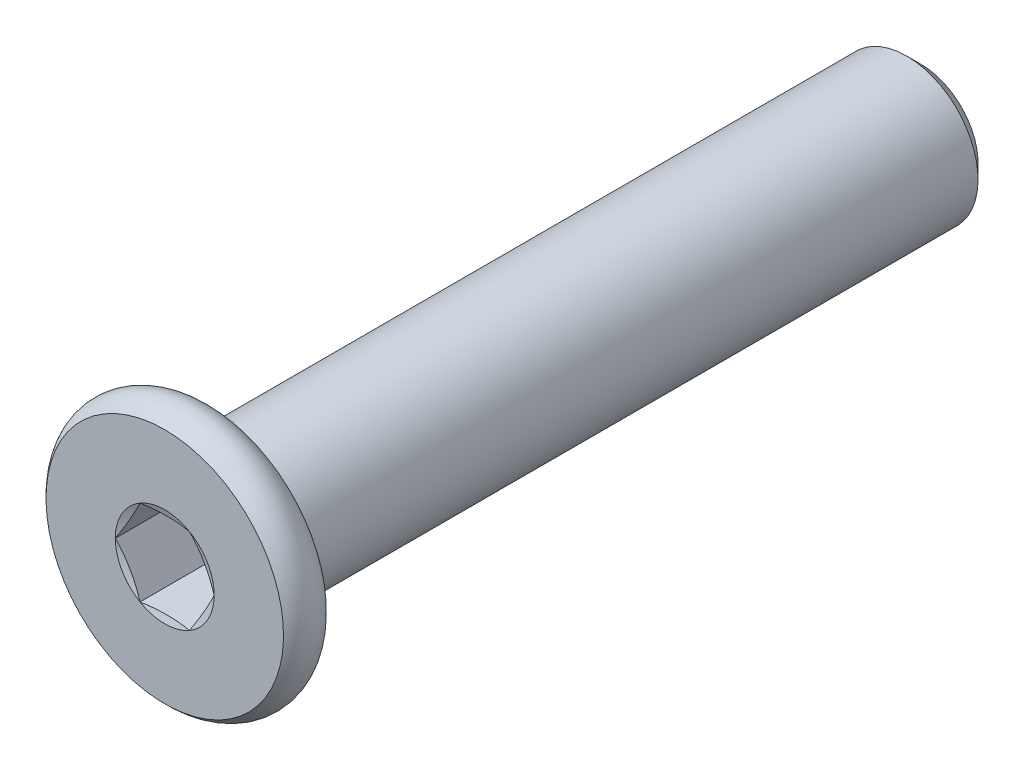
ISO-10303-21;
HEADER;
FILE_DESCRIPTION(('STEP AP214'),'2;1');
FILE_NAME('part.step','',(''),(''),'','','');
FILE_SCHEMA(('AUTOMOTIVE_DESIGN { 1 0 10303 214 1 1 1 1 }'));
ENDSEC;
DATA;
#1=APPLICATION_CONTEXT('core data for automotive mechanical design processes');
#2=APPLICATION_PROTOCOL_DEFINITION('international standard','automotive_design',2000,#1);
#3=PRODUCT_CONTEXT('',#1,'mechanical');
#4=PRODUCT('Part','Part','',(#3));
#5=PRODUCT_RELATED_PRODUCT_CATEGORY('part','',(#4));
#6=PRODUCT_DEFINITION_FORMATION('','',#4);
#7=PRODUCT_DEFINITION_CONTEXT('part definition',#1,'design');
#8=PRODUCT_DEFINITION('design','',#6,#7);
#9=PRODUCT_DEFINITION_SHAPE('','',#8);
#10=(LENGTH_UNIT() NAMED_UNIT(*) SI_UNIT(.MILLI.,.METRE.));
#11=(NAMED_UNIT(*) PLANE_ANGLE_UNIT() SI_UNIT($,.RADIAN.));
#12=(NAMED_UNIT(*) SI_UNIT($,.STERADIAN.) SOLID_ANGLE_UNIT());
#13=UNCERTAINTY_MEASURE_WITH_UNIT(LENGTH_MEASURE(1.E-05),#10,'distance_accuracy_value','');
#14=(GEOMETRIC_REPRESENTATION_CONTEXT(3) GLOBAL_UNCERTAINTY_ASSIGNED_CONTEXT((#13)) GLOBAL_UNIT_ASSIGNED_CONTEXT((#10,
#11,#12)) REPRESENTATION_CONTEXT('',''));
#15=CARTESIAN_POINT('',(0.,0.,0.));
#16=DIRECTION('',(0.,0.,1.));
#17=DIRECTION('',(1.,0.,0.));
#18=AXIS2_PLACEMENT_3D('',#15,#16,#17);
#19=CARTESIAN_POINT('',(0.,0.,19.6597066666667));
#20=DIRECTION('',(0.,0.,1.));
#21=DIRECTION('',(1.,0.,0.));
#22=AXIS2_PLACEMENT_3D('',#19,#20,#21);
#23=SPHERICAL_SURFACE('',#22,5.14970666666667);
#24=CARTESIAN_POINT('',(0.,1.49995599935464,19.6597066666667));
#25=DIRECTION('',(0.,1.,0.));
#26=DIRECTION('',(0.,0.,1.));
#27=AXIS2_PLACEMENT_3D('',#24,#25,#26);
#28=CIRCLE('',#27,4.92641966875652);
#29=CARTESIAN_POINT('',(0.866,1.49995599935464,14.81));
#30=VERTEX_POINT('',#29);
#31=CARTESIAN_POINT('',(-0.866,1.49995599935464,14.81));
#32=VERTEX_POINT('',#31);
#33=EDGE_CURVE('E141',#30,#32,#28,.T.);
#34=ORIENTED_EDGE('',*,*,#33,.F.);
#35=CARTESIAN_POINT('',(0.,0.,14.81));
#36=DIRECTION('',(0.,0.,-1.));
#37=DIRECTION('',(0.,1.,0.));
#38=AXIS2_PLACEMENT_3D('',#35,#36,#37);
#39=CIRCLE('',#38,1.732);
#40=EDGE_CURVE('E167',#32,#30,#39,.T.);
#41=ORIENTED_EDGE('',*,*,#40,.F.);
#42=EDGE_LOOP('',(#34,#41));
#43=FACE_BOUND('',#42,.T.);
#44=ADVANCED_FACE('F16',(#43),#23,.F.);
#45=CARTESIAN_POINT('',(0.,0.,19.6597066666667));
#46=DIRECTION('',(0.,0.,1.));
#47=DIRECTION('',(1.,0.,0.));
#48=AXIS2_PLACEMENT_3D('',#45,#46,#47);
#49=SPHERICAL_SURFACE('',#48,5.14970666666667);
#50=CARTESIAN_POINT('',(0.,0.,14.81));
#51=DIRECTION('',(0.,0.,-1.));
#52=DIRECTION('',(0.,1.,0.));
#53=AXIS2_PLACEMENT_3D('',#50,#51,#52);
#54=CIRCLE('',#53,1.732);
#55=CARTESIAN_POINT('',(1.732,0.,14.81));
#56=VERTEX_POINT('',#55);
#57=CARTESIAN_POINT('',(0.866,-1.49995599935465,14.81));
#58=VERTEX_POINT('',#57);
#59=EDGE_CURVE('E126',#56,#58,#54,.T.);
#60=ORIENTED_EDGE('',*,*,#59,.F.);
#61=CARTESIAN_POINT('',(1.299,-0.749977999677325,19.6597066666667));
#62=DIRECTION('',(0.866025403784439,-0.5,0.));
#63=DIRECTION('',(0.,0.,-1.));
#64=AXIS2_PLACEMENT_3D('',#61,#62,#63);
#65=CIRCLE('',#64,4.92641966875652);
#66=EDGE_CURVE('E110',#58,#56,#65,.T.);
#67=ORIENTED_EDGE('',*,*,#66,.F.);
#68=EDGE_LOOP('',(#60,#67));
#69=FACE_BOUND('',#68,.T.);
#70=ADVANCED_FACE('F223',(#69),#49,.F.);
#71=CARTESIAN_POINT('',(0.,0.,19.6597066666667));
#72=DIRECTION('',(0.,0.,1.));
#73=DIRECTION('',(1.,0.,0.));
#74=AXIS2_PLACEMENT_3D('',#71,#72,#73);
#75=SPHERICAL_SURFACE('',#74,5.14970666666667);
#76=CARTESIAN_POINT('',(0.,0.,14.81));
#77=DIRECTION('',(0.,0.,-1.));
#78=DIRECTION('',(0.,1.,0.));
#79=AXIS2_PLACEMENT_3D('',#76,#77,#78);
#80=CIRCLE('',#79,1.732);
#81=CARTESIAN_POINT('',(-0.866,-1.49995599935465,14.81));
#82=VERTEX_POINT('',#81);
#83=EDGE_CURVE('E130',#58,#82,#80,.T.);
#84=ORIENTED_EDGE('',*,*,#83,.F.);
#85=CARTESIAN_POINT('',(0.,-1.49995599935465,19.6597066666667));
#86=DIRECTION('',(0.,-1.,0.));
#87=DIRECTION('',(0.,0.,-1.));
#88=AXIS2_PLACEMENT_3D('',#85,#86,#87);
#89=CIRCLE('',#88,4.92641966875652);
#90=EDGE_CURVE('E96',#82,#58,#89,.T.);
#91=ORIENTED_EDGE('',*,*,#90,.F.);
#92=EDGE_LOOP('',(#84,#91));
#93=FACE_BOUND('',#92,.T.);
#94=ADVANCED_FACE('F219',(#93),#75,.F.);
#95=CARTESIAN_POINT('',(0.,0.,19.6597066666667));
#96=DIRECTION('',(0.,0.,1.));
#97=DIRECTION('',(1.,0.,0.));
#98=AXIS2_PLACEMENT_3D('',#95,#96,#97);
#99=SPHERICAL_SURFACE('',#98,5.14970666666667);
#100=CARTESIAN_POINT('',(0.,0.,14.81));
#101=DIRECTION('',(0.,0.,-1.));
#102=DIRECTION('',(0.,1.,0.));
#103=AXIS2_PLACEMENT_3D('',#100,#101,#102);
#104=CIRCLE('',#103,1.732);
#105=CARTESIAN_POINT('',(-1.732,0.,14.81));
#106=VERTEX_POINT('',#105);
#107=EDGE_CURVE('E159',#82,#106,#104,.T.);
#108=ORIENTED_EDGE('',*,*,#107,.F.);
#109=CARTESIAN_POINT('',(-1.299,-0.749977999677326,19.6597066666667));
#110=DIRECTION('',(-0.866025403784439,-0.5,0.));
#111=DIRECTION('',(0.,0.,-1.));
#112=AXIS2_PLACEMENT_3D('',#109,#110,#111);
#113=CIRCLE('',#112,4.92641966875652);
#114=EDGE_CURVE('E11',#106,#82,#113,.T.);
#115=ORIENTED_EDGE('',*,*,#114,.F.);
#116=EDGE_LOOP('',(#108,#115));
#117=FACE_BOUND('',#116,.T.);
#118=ADVANCED_FACE('F209',(#117),#99,.F.);
#119=CARTESIAN_POINT('',(0.,0.,19.6597066666667));
#120=DIRECTION('',(0.,0.,1.));
#121=DIRECTION('',(1.,0.,0.));
#122=AXIS2_PLACEMENT_3D('',#119,#120,#121);
#123=SPHERICAL_SURFACE('',#122,5.14970666666667);
#124=CARTESIAN_POINT('',(0.,0.,14.81));
#125=DIRECTION('',(0.,0.,-1.));
#126=DIRECTION('',(0.,1.,0.));
#127=AXIS2_PLACEMENT_3D('',#124,#125,#126);
#128=CIRCLE('',#127,1.732);
#129=EDGE_CURVE('E170',#106,#32,#128,.T.);
#130=ORIENTED_EDGE('',*,*,#129,.F.);
#131=CARTESIAN_POINT('',(-1.299,0.749977999677323,19.6597066666667));
#132=DIRECTION('',(-0.866025403784439,0.5,0.));
#133=DIRECTION('',(0.,0.,1.));
#134=AXIS2_PLACEMENT_3D('',#131,#132,#133);
#135=CIRCLE('',#134,4.92641966875652);
#136=EDGE_CURVE('E150',#32,#106,#135,.T.);
#137=ORIENTED_EDGE('',*,*,#136,.F.);
#138=EDGE_LOOP('',(#130,#137));
#139=FACE_BOUND('',#138,.T.);
#140=ADVANCED_FACE('F226',(#139),#123,.F.);
#141=CARTESIAN_POINT('',(0.,0.,19.6597066666667));
#142=DIRECTION('',(0.,0.,1.));
#143=DIRECTION('',(1.,0.,0.));
#144=AXIS2_PLACEMENT_3D('',#141,#142,#143);
#145=SPHERICAL_SURFACE('',#144,5.14970666666667);
#146=CARTESIAN_POINT('',(1.299,0.749977999677323,19.6597066666667));
#147=DIRECTION('',(0.866025403784439,0.5,0.));
#148=DIRECTION('',(0.,0.,-1.));
#149=AXIS2_PLACEMENT_3D('',#146,#147,#148);
#150=CIRCLE('',#149,4.92641966875652);
#151=EDGE_CURVE('E131',#56,#30,#150,.T.);
#152=ORIENTED_EDGE('',*,*,#151,.F.);
#153=CARTESIAN_POINT('',(0.,0.,14.81));
#154=DIRECTION('',(0.,0.,-1.));
#155=DIRECTION('',(0.,1.,0.));
#156=AXIS2_PLACEMENT_3D('',#153,#154,#155);
#157=CIRCLE('',#156,1.732);
#158=EDGE_CURVE('E33',#30,#56,#157,.T.);
#159=ORIENTED_EDGE('',*,*,#158,.F.);
#160=EDGE_LOOP('',(#152,#159));
#161=FACE_BOUND('',#160,.T.);
#162=ADVANCED_FACE('F224',(#161),#145,.F.);
#163=CARTESIAN_POINT('',(-0.866,-1.49995599935465,14.81));
#164=DIRECTION('',(-0.866025403784439,-0.5,0.));
#165=DIRECTION('',(-0.5,0.866025403784439,0.));
#166=AXIS2_PLACEMENT_3D('',#163,#164,#165);
#167=PLANE('',#166);
#168=ORIENTED_EDGE('',*,*,#114,.T.);
#169=DIRECTION('',(0.,0.,-1.));
#170=VECTOR('',#169,1.);
#171=CARTESIAN_POINT('',(-0.866,-1.49995599935465,14.81));
#172=LINE('',#171,#170);
#173=CARTESIAN_POINT('',(-0.866,-1.49995599935465,12.51));
#174=VERTEX_POINT('',#173);
#175=EDGE_CURVE('E26',#82,#174,#172,.T.);
#176=ORIENTED_EDGE('',*,*,#175,.T.);
#177=DIRECTION('',(-0.5,0.866025403784439,0.));
#178=VECTOR('',#177,1.);
#179=CARTESIAN_POINT('',(-0.866,-1.49995599935465,12.51));
#180=LINE('',#179,#178);
#181=CARTESIAN_POINT('',(-1.732,0.,12.51));
#182=VERTEX_POINT('',#181);
#183=EDGE_CURVE('E85',#174,#182,#180,.T.);
#184=ORIENTED_EDGE('',*,*,#183,.T.);
#185=DIRECTION('',(0.,0.,-1.));
#186=VECTOR('',#185,1.);
#187=CARTESIAN_POINT('',(-1.732,0.,14.81));
#188=LINE('',#187,#186);
#189=EDGE_CURVE('E156',#106,#182,#188,.T.);
#190=ORIENTED_EDGE('',*,*,#189,.F.);
#191=EDGE_LOOP('',(#168,#176,#184,#190));
#192=FACE_BOUND('',#191,.T.);
#193=ADVANCED_FACE('F99',(#192),#167,.F.);
#194=CARTESIAN_POINT('',(0.866,-1.49995599935465,14.81));
#195=DIRECTION('',(0.,-1.,0.));
#196=DIRECTION('',(-1.,0.,0.));
#197=AXIS2_PLACEMENT_3D('',#194,#195,#196);
#198=PLANE('',#197);
#199=ORIENTED_EDGE('',*,*,#90,.T.);
#200=DIRECTION('',(0.,0.,-1.));
#201=VECTOR('',#200,1.);
#202=CARTESIAN_POINT('',(0.866,-1.49995599935465,14.81));
#203=LINE('',#202,#201);
#204=CARTESIAN_POINT('',(0.866,-1.49995599935465,12.51));
#205=VERTEX_POINT('',#204);
#206=EDGE_CURVE('E107',#58,#205,#203,.T.);
#207=ORIENTED_EDGE('',*,*,#206,.T.);
#208=DIRECTION('',(-1.,0.,0.));
#209=VECTOR('',#208,1.);
#210=CARTESIAN_POINT('',(0.866,-1.49995599935465,12.51));
#211=LINE('',#210,#209);
#212=EDGE_CURVE('E89',#205,#174,#211,.T.);
#213=ORIENTED_EDGE('',*,*,#212,.T.);
#214=ORIENTED_EDGE('',*,*,#175,.F.);
#215=EDGE_LOOP('',(#199,#207,#213,#214));
#216=FACE_BOUND('',#215,.T.);
#217=ADVANCED_FACE('F105',(#216),#198,.F.);
#218=CARTESIAN_POINT('',(1.732,0.,14.81));
#219=DIRECTION('',(0.866025403784439,-0.5,0.));
#220=DIRECTION('',(-0.5,-0.866025403784439,0.));
#221=AXIS2_PLACEMENT_3D('',#218,#219,#220);
#222=PLANE('',#221);
#223=ORIENTED_EDGE('',*,*,#66,.T.);
#224=DIRECTION('',(0.,0.,-1.));
#225=VECTOR('',#224,1.);
#226=CARTESIAN_POINT('',(1.732,0.,14.81));
#227=LINE('',#226,#225);
#228=CARTESIAN_POINT('',(1.732,0.,12.51));
#229=VERTEX_POINT('',#228);
#230=EDGE_CURVE('E120',#56,#229,#227,.T.);
#231=ORIENTED_EDGE('',*,*,#230,.T.);
#232=DIRECTION('',(-0.5,-0.866025403784439,0.));
#233=VECTOR('',#232,1.);
#234=CARTESIAN_POINT('',(1.732,0.,12.51));
#235=LINE('',#234,#233);
#236=EDGE_CURVE('E135',#229,#205,#235,.T.);
#237=ORIENTED_EDGE('',*,*,#236,.T.);
#238=ORIENTED_EDGE('',*,*,#206,.F.);
#239=EDGE_LOOP('',(#223,#231,#237,#238));
#240=FACE_BOUND('',#239,.T.);
#241=ADVANCED_FACE('F221',(#240),#222,.F.);
#242=CARTESIAN_POINT('',(0.866,1.49995599935464,14.81));
#243=DIRECTION('',(0.866025403784439,0.5,0.));
#244=DIRECTION('',(0.5,-0.866025403784439,0.));
#245=AXIS2_PLACEMENT_3D('',#242,#243,#244);
#246=PLANE('',#245);
#247=ORIENTED_EDGE('',*,*,#151,.T.);
#248=DIRECTION('',(0.,0.,-1.));
#249=VECTOR('',#248,1.);
#250=CARTESIAN_POINT('',(0.866,1.49995599935464,14.81));
#251=LINE('',#250,#249);
#252=CARTESIAN_POINT('',(0.866,1.49995599935465,12.51));
#253=VERTEX_POINT('',#252);
#254=EDGE_CURVE('E136',#30,#253,#251,.T.);
#255=ORIENTED_EDGE('',*,*,#254,.T.);
#256=DIRECTION('',(0.5,-0.866025403784439,0.));
#257=VECTOR('',#256,1.);
#258=CARTESIAN_POINT('',(0.866,1.49995599935465,12.51));
#259=LINE('',#258,#257);
#260=EDGE_CURVE('E147',#253,#229,#259,.T.);
#261=ORIENTED_EDGE('',*,*,#260,.T.);
#262=ORIENTED_EDGE('',*,*,#230,.F.);
#263=EDGE_LOOP('',(#247,#255,#261,#262));
#264=FACE_BOUND('',#263,.T.);
#265=ADVANCED_FACE('F18',(#264),#246,.F.);
#266=CARTESIAN_POINT('',(-0.866,1.49995599935464,14.81));
#267=DIRECTION('',(0.,1.,0.));
#268=DIRECTION('',(1.,0.,0.));
#269=AXIS2_PLACEMENT_3D('',#266,#267,#268);
#270=PLANE('',#269);
#271=ORIENTED_EDGE('',*,*,#33,.T.);
#272=DIRECTION('',(0.,0.,-1.));
#273=VECTOR('',#272,1.);
#274=CARTESIAN_POINT('',(-0.866,1.49995599935464,14.81));
#275=LINE('',#274,#273);
#276=CARTESIAN_POINT('',(-0.866,1.49995599935464,12.51));
#277=VERTEX_POINT('',#276);
#278=EDGE_CURVE('E139',#32,#277,#275,.T.);
#279=ORIENTED_EDGE('',*,*,#278,.T.);
#280=DIRECTION('',(1.,0.,0.));
#281=VECTOR('',#280,1.);
#282=CARTESIAN_POINT('',(-0.866,1.49995599935464,12.51));
#283=LINE('',#282,#281);
#284=EDGE_CURVE('E71',#277,#253,#283,.T.);
#285=ORIENTED_EDGE('',*,*,#284,.T.);
#286=ORIENTED_EDGE('',*,*,#254,.F.);
#287=EDGE_LOOP('',(#271,#279,#285,#286));
#288=FACE_BOUND('',#287,.T.);
#289=ADVANCED_FACE('F202',(#288),#270,.F.);
#290=CARTESIAN_POINT('',(-1.732,0.,14.81));
#291=DIRECTION('',(-0.866025403784439,0.5,0.));
#292=DIRECTION('',(0.5,0.866025403784439,0.));
#293=AXIS2_PLACEMENT_3D('',#290,#291,#292);
#294=PLANE('',#293);
#295=ORIENTED_EDGE('',*,*,#136,.T.);
#296=ORIENTED_EDGE('',*,*,#189,.T.);
#297=DIRECTION('',(0.5,0.866025403784439,0.));
#298=VECTOR('',#297,1.);
#299=CARTESIAN_POINT('',(-1.732,0.,12.51));
#300=LINE('',#299,#298);
#301=EDGE_CURVE('E92',#182,#277,#300,.T.);
#302=ORIENTED_EDGE('',*,*,#301,.T.);
#303=ORIENTED_EDGE('',*,*,#278,.F.);
#304=EDGE_LOOP('',(#295,#296,#302,#303));
#305=FACE_BOUND('',#304,.T.);
#306=ADVANCED_FACE('F205',(#305),#294,.F.);
#307=CARTESIAN_POINT('',(0.,0.,12.51));
#308=DIRECTION('',(0.,0.,-1.));
#309=DIRECTION('',(-1.,0.,0.));
#310=AXIS2_PLACEMENT_3D('',#307,#308,#309);
#311=PLANE('',#310);
#312=ORIENTED_EDGE('',*,*,#236,.F.);
#313=ORIENTED_EDGE('',*,*,#260,.F.);
#314=ORIENTED_EDGE('',*,*,#284,.F.);
#315=ORIENTED_EDGE('',*,*,#301,.F.);
#316=ORIENTED_EDGE('',*,*,#183,.F.);
#317=ORIENTED_EDGE('',*,*,#212,.F.);
#318=EDGE_LOOP('',(#312,#313,#314,#315,#316,#317));
#319=FACE_BOUND('',#318,.T.);
#320=ADVANCED_FACE('F87',(#319),#311,.F.);
#321=CARTESIAN_POINT('',(0.,0.,-4.19000000000031));
#322=DIRECTION('',(0.,0.,1.));
#323=DIRECTION('',(0.,1.,0.));
#324=AXIS2_PLACEMENT_3D('',#321,#322,#323);
#325=CYLINDRICAL_SURFACE('',#324,2.50000000000257);
#326=CARTESIAN_POINT('',(0.,0.,13.31));
#327=DIRECTION('',(0.,0.,-1.));
#328=DIRECTION('',(1.,0.,0.));
#329=AXIS2_PLACEMENT_3D('',#326,#327,#328);
#330=CIRCLE('',#329,2.5);
#331=CARTESIAN_POINT('',(0.,2.5,13.31));
#332=VERTEX_POINT('',#331);
#333=EDGE_CURVE('E66',#332,#332,#330,.T.);
#334=ORIENTED_EDGE('',*,*,#333,.T.);
#335=EDGE_LOOP('',(#334));
#336=FACE_BOUND('',#335,.T.);
#337=CARTESIAN_POINT('',(0.,0.,-11.1900000000006));
#338=DIRECTION('',(0.,0.,-1.));
#339=DIRECTION('',(1.,0.,0.));
#340=AXIS2_PLACEMENT_3D('',#337,#338,#339);
#341=CIRCLE('',#340,2.50000000000361);
#342=CARTESIAN_POINT('',(0.,2.50000000000365,-11.1900000000006));
#343=VERTEX_POINT('',#342);
#344=EDGE_CURVE('E138',#343,#343,#341,.T.);
#345=ORIENTED_EDGE('',*,*,#344,.F.);
#346=EDGE_LOOP('',(#345));
#347=FACE_BOUND('',#346,.T.);
#348=ADVANCED_FACE('F275',(#336,#347),#325,.T.);
#349=CARTESIAN_POINT('',(0.,0.,-11.4400000000003));
#350=DIRECTION('',(0.,0.,1.));
#351=DIRECTION('',(0.,1.,0.));
#352=AXIS2_PLACEMENT_3D('',#349,#350,#351);
#353=CONICAL_SURFACE('',#352,2.25000000000182,0.785398163401622);
#354=ORIENTED_EDGE('',*,*,#344,.T.);
#355=EDGE_LOOP('',(#354));
#356=FACE_BOUND('',#355,.T.);
#357=CARTESIAN_POINT('',(0.,0.,-11.69));
#358=DIRECTION('',(0.,0.,-1.));
#359=DIRECTION('',(1.,0.,0.));
#360=AXIS2_PLACEMENT_3D('',#357,#358,#359);
#361=CIRCLE('',#360,2.00000000000003);
#362=CARTESIAN_POINT('',(0.,2.00000000000007,-11.69));
#363=VERTEX_POINT('',#362);
#364=EDGE_CURVE('E129',#363,#363,#361,.T.);
#365=ORIENTED_EDGE('',*,*,#364,.F.);
#366=EDGE_LOOP('',(#365));
#367=FACE_BOUND('',#366,.T.);
#368=ADVANCED_FACE('F262',(#356,#367),#353,.T.);
#369=CARTESIAN_POINT('',(0.,0.,-11.69));
#370=DIRECTION('',(0.,0.,-1.));
#371=DIRECTION('',(-1.,0.,0.));
#372=AXIS2_PLACEMENT_3D('',#369,#370,#371);
#373=PLANE('',#372);
#374=ORIENTED_EDGE('',*,*,#364,.T.);
#375=EDGE_LOOP('',(#374));
#376=FACE_BOUND('',#375,.T.);
#377=ADVANCED_FACE('F258',(#376),#373,.T.);
#378=CARTESIAN_POINT('',(0.,4.16143782776616,14.81));
#379=DIRECTION('',(0.,0.,1.));
#380=DIRECTION('',(1.,0.,0.));
#381=AXIS2_PLACEMENT_3D('',#378,#379,#380);
#382=PLANE('',#381);
#383=ORIENTED_EDGE('',*,*,#59,.T.);
#384=ORIENTED_EDGE('',*,*,#83,.T.);
#385=ORIENTED_EDGE('',*,*,#107,.T.);
#386=ORIENTED_EDGE('',*,*,#129,.T.);
#387=ORIENTED_EDGE('',*,*,#40,.T.);
#388=ORIENTED_EDGE('',*,*,#158,.T.);
#389=EDGE_LOOP('',(#383,#384,#385,#386,#387,#388));
#390=FACE_BOUND('',#389,.T.);
#391=CARTESIAN_POINT('',(0.,0.,14.81));
#392=DIRECTION('',(0.,0.,-1.));
#393=DIRECTION('',(1.,0.,0.));
#394=AXIS2_PLACEMENT_3D('',#391,#392,#393);
#395=CIRCLE('',#394,4.16143782776613);
#396=CARTESIAN_POINT('',(0.,4.16143782776616,14.81));
#397=VERTEX_POINT('',#396);
#398=EDGE_CURVE('E124',#397,#397,#395,.T.);
#399=ORIENTED_EDGE('',*,*,#398,.F.);
#400=EDGE_LOOP('',(#399));
#401=FACE_BOUND('',#400,.T.);
#402=ADVANCED_FACE('F214',(#390,#401),#382,.T.);
#403=CARTESIAN_POINT('',(0.,0.,14.0600000000004));
#404=DIRECTION('',(0.,0.,-1.));
#405=DIRECTION('',(-1.,0.,0.));
#406=AXIS2_PLACEMENT_3D('',#403,#404,#405);
#407=TOROIDAL_SURFACE('',#406,3.49999999999993,1.);
#408=ORIENTED_EDGE('',*,*,#398,.T.);
#409=EDGE_LOOP('',(#408));
#410=FACE_BOUND('',#409,.T.);
#411=CARTESIAN_POINT('',(0.,0.,13.31));
#412=DIRECTION('',(0.,0.,-1.));
#413=DIRECTION('',(1.,0.,0.));
#414=AXIS2_PLACEMENT_3D('',#411,#412,#413);
#415=CIRCLE('',#414,4.16143782776613);
#416=CARTESIAN_POINT('',(0.,4.16143782776616,13.31));
#417=VERTEX_POINT('',#416);
#418=EDGE_CURVE('E183',#417,#417,#415,.T.);
#419=ORIENTED_EDGE('',*,*,#418,.F.);
#420=EDGE_LOOP('',(#419));
#421=FACE_BOUND('',#420,.T.);
#422=ADVANCED_FACE('F244',(#410,#421),#407,.T.);
#423=CARTESIAN_POINT('',(0.,2.5,13.31));
#424=DIRECTION('',(0.,0.,-1.));
#425=DIRECTION('',(-1.,0.,0.));
#426=AXIS2_PLACEMENT_3D('',#423,#424,#425);
#427=PLANE('',#426);
#428=ORIENTED_EDGE('',*,*,#418,.T.);
#429=EDGE_LOOP('',(#428));
#430=FACE_BOUND('',#429,.T.);
#431=ORIENTED_EDGE('',*,*,#333,.F.);
#432=EDGE_LOOP('',(#431));
#433=FACE_BOUND('',#432,.T.);
#434=ADVANCED_FACE('F242',(#430,#433),#427,.T.);
#435=CLOSED_SHELL('',(#44,#70,#94,#118,#140,#162,#193,#217,#241,#265,#289,#306,#320,#348,#368,
#377,#402,#422,#434));
#436=MANIFOLD_SOLID_BREP('B1',#435);
#437=ADVANCED_BREP_SHAPE_REPRESENTATION('',(#18,#436),#14);
#438=SHAPE_DEFINITION_REPRESENTATION(#9,#437);
ENDSEC;
END-ISO-10303-21;
